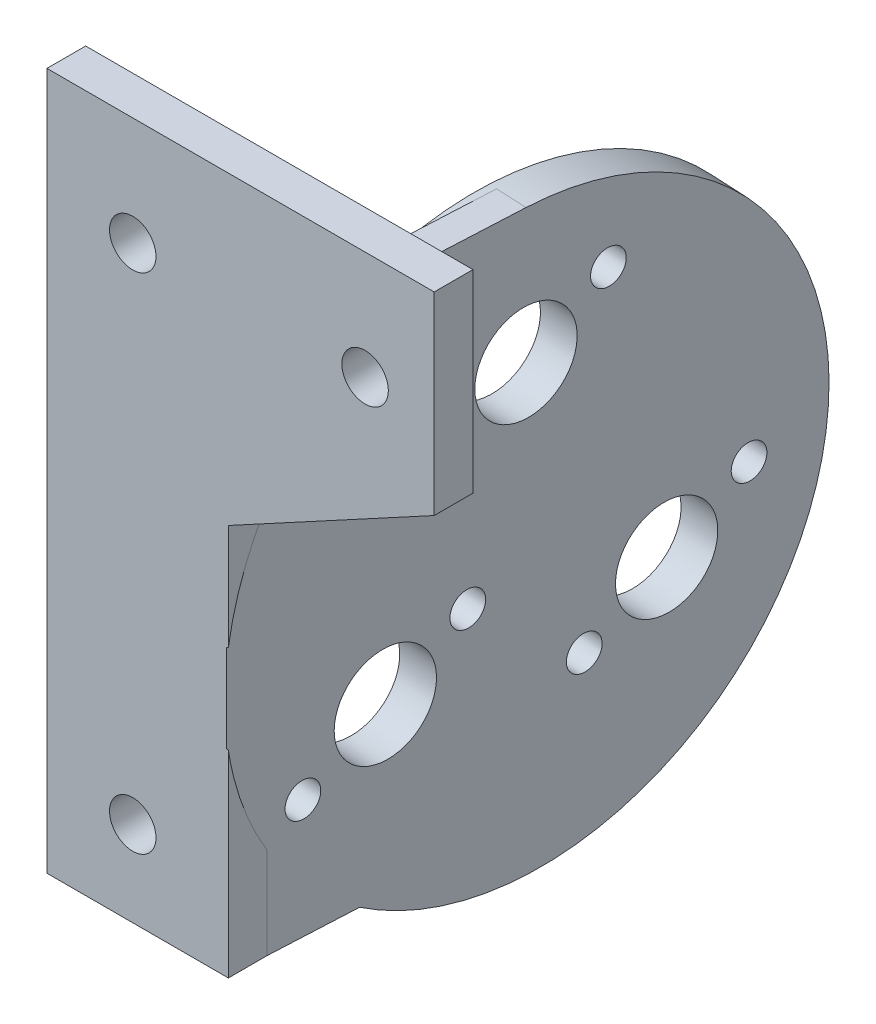
ISO-10303-21;
HEADER;
FILE_DESCRIPTION(('STEP AP214'),'2;1');
FILE_NAME('part.step','',(''),(''),'','','');
FILE_SCHEMA(('AUTOMOTIVE_DESIGN { 1 0 10303 214 1 1 1 1 }'));
ENDSEC;
DATA;
#1=APPLICATION_CONTEXT('core data for automotive mechanical design processes');
#2=APPLICATION_PROTOCOL_DEFINITION('international standard','automotive_design',2000,#1);
#3=PRODUCT_CONTEXT('',#1,'mechanical');
#4=PRODUCT('Part','Part','',(#3));
#5=PRODUCT_RELATED_PRODUCT_CATEGORY('part','',(#4));
#6=PRODUCT_DEFINITION_FORMATION('','',#4);
#7=PRODUCT_DEFINITION_CONTEXT('part definition',#1,'design');
#8=PRODUCT_DEFINITION('design','',#6,#7);
#9=PRODUCT_DEFINITION_SHAPE('','',#8);
#10=(LENGTH_UNIT() NAMED_UNIT(*) SI_UNIT(.MILLI.,.METRE.));
#11=(NAMED_UNIT(*) PLANE_ANGLE_UNIT() SI_UNIT($,.RADIAN.));
#12=(NAMED_UNIT(*) SI_UNIT($,.STERADIAN.) SOLID_ANGLE_UNIT());
#13=UNCERTAINTY_MEASURE_WITH_UNIT(LENGTH_MEASURE(1.E-05),#10,'distance_accuracy_value','');
#14=(GEOMETRIC_REPRESENTATION_CONTEXT(3) GLOBAL_UNCERTAINTY_ASSIGNED_CONTEXT((#13)) GLOBAL_UNIT_ASSIGNED_CONTEXT((#10,
#11,#12)) REPRESENTATION_CONTEXT('',''));
#15=CARTESIAN_POINT('',(0.,0.,0.));
#16=DIRECTION('',(0.,0.,1.));
#17=DIRECTION('',(1.,0.,0.));
#18=AXIS2_PLACEMENT_3D('',#15,#16,#17);
#19=CARTESIAN_POINT('',(0.,0.,39.3656227937916));
#20=DIRECTION('',(0.,0.,1.));
#21=DIRECTION('',(1.,0.,0.));
#22=AXIS2_PLACEMENT_3D('',#19,#20,#21);
#23=PLANE('',#22);
#24=CARTESIAN_POINT('',(241.789665534921,-11.7364504773365,39.3656227937916));
#25=DIRECTION('',(0.,0.,1.));
#26=DIRECTION('',(1.,0.,0.));
#27=AXIS2_PLACEMENT_3D('',#24,#25,#26);
#28=CIRCLE('',#27,1.90499999999999);
#29=CARTESIAN_POINT('',(243.694665534921,-11.7364504773365,39.3656227937916));
#30=VERTEX_POINT('',#29);
#31=EDGE_CURVE('E637',#30,#30,#28,.T.);
#32=ORIENTED_EDGE('',*,*,#31,.T.);
#33=EDGE_LOOP('',(#32));
#34=FACE_BOUND('',#33,.T.);
#35=CARTESIAN_POINT('',(241.789665534921,29.5385495226635,39.3656227937916));
#36=DIRECTION('',(0.,0.,1.));
#37=DIRECTION('',(1.,0.,0.));
#38=AXIS2_PLACEMENT_3D('',#35,#36,#37);
#39=CIRCLE('',#38,1.90499999999999);
#40=CARTESIAN_POINT('',(243.694665534921,29.5385495226635,39.3656227937916));
#41=VERTEX_POINT('',#40);
#42=EDGE_CURVE('E641',#41,#41,#39,.T.);
#43=ORIENTED_EDGE('',*,*,#42,.T.);
#44=EDGE_LOOP('',(#43));
#45=FACE_BOUND('',#44,.T.);
#46=CARTESIAN_POINT('',(260.839665534921,29.5385495226635,39.3656227937916));
#47=DIRECTION('',(0.,0.,1.));
#48=DIRECTION('',(1.,0.,0.));
#49=AXIS2_PLACEMENT_3D('',#46,#47,#48);
#50=CIRCLE('',#49,1.90499999999999);
#51=CARTESIAN_POINT('',(262.744665534921,29.5385495226635,39.3656227937916));
#52=VERTEX_POINT('',#51);
#53=EDGE_CURVE('E346',#52,#52,#50,.T.);
#54=ORIENTED_EDGE('',*,*,#53,.T.);
#55=EDGE_LOOP('',(#54));
#56=FACE_BOUND('',#55,.T.);
#57=DIRECTION('',(0.,1.,0.));
#58=VECTOR('',#57,1.);
#59=CARTESIAN_POINT('',(247.086588779306,4.48040659166999E-13,39.3656227937916));
#60=LINE('',#59,#58);
#61=CARTESIAN_POINT('',(247.086588779306,-18.7214504773365,39.3656227937916));
#62=VERTEX_POINT('',#61);
#63=CARTESIAN_POINT('',(247.086588779306,-11.0177145985927,39.3656227937916));
#64=VERTEX_POINT('',#63);
#65=EDGE_CURVE('E308',#62,#64,#60,.T.);
#66=ORIENTED_EDGE('',*,*,#65,.F.);
#67=DIRECTION('',(-1.,0.,0.));
#68=VECTOR('',#67,1.);
#69=CARTESIAN_POINT('',(266.505940447926,-18.7214504773365,39.3656227937916));
#70=LINE('',#69,#68);
#71=CARTESIAN_POINT('',(234.755940447926,-18.7214504773365,39.3656227937916));
#72=VERTEX_POINT('',#71);
#73=EDGE_CURVE('E200',#62,#72,#70,.T.);
#74=ORIENTED_EDGE('',*,*,#73,.T.);
#75=DIRECTION('',(0.,1.,0.));
#76=VECTOR('',#75,1.);
#77=CARTESIAN_POINT('',(234.755940447926,-18.7214504773365,39.3656227937916));
#78=LINE('',#77,#76);
#79=CARTESIAN_POINT('',(234.755940447926,38.4285495226636,39.3656227937916));
#80=VERTEX_POINT('',#79);
#81=EDGE_CURVE('E203',#72,#80,#78,.T.);
#82=ORIENTED_EDGE('',*,*,#81,.T.);
#83=DIRECTION('',(1.,0.,0.));
#84=VECTOR('',#83,1.);
#85=CARTESIAN_POINT('',(266.505940447926,38.4285495226636,39.3656227937916));
#86=LINE('',#85,#84);
#87=CARTESIAN_POINT('',(266.505940447926,38.4285495226636,39.3656227937916));
#88=VERTEX_POINT('',#87);
#89=EDGE_CURVE('E205',#80,#88,#86,.T.);
#90=ORIENTED_EDGE('',*,*,#89,.T.);
#91=DIRECTION('',(0.,-1.,0.));
#92=VECTOR('',#91,1.);
#93=CARTESIAN_POINT('',(266.505940447926,-18.7214504773365,39.3656227937916));
#94=LINE('',#93,#92);
#95=CARTESIAN_POINT('',(266.505940447926,22.5535495226636,39.3656227937916));
#96=VERTEX_POINT('',#95);
#97=EDGE_CURVE('E197',#88,#96,#94,.T.);
#98=ORIENTED_EDGE('',*,*,#97,.T.);
#99=DIRECTION('',(0.879222113749646,0.476412084957554,0.));
#100=VECTOR('',#99,1.);
#101=CARTESIAN_POINT('',(249.629734325934,13.4090700799627,39.3656227937916));
#102=LINE('',#101,#100);
#103=CARTESIAN_POINT('',(249.629734325934,13.4090700799628,39.3656227937916));
#104=VERTEX_POINT('',#103);
#105=EDGE_CURVE('E166',#104,#96,#102,.T.);
#106=ORIENTED_EDGE('',*,*,#105,.F.);
#107=DIRECTION('',(0.,1.,0.));
#108=VECTOR('',#107,1.);
#109=CARTESIAN_POINT('',(249.629734325934,4.52652130039207E-13,39.3656227937916));
#110=LINE('',#109,#108);
#111=CARTESIAN_POINT('',(249.629734325934,24.7887495226636,39.3656227937916));
#112=VERTEX_POINT('',#111);
#113=EDGE_CURVE('E294',#104,#112,#110,.T.);
#114=ORIENTED_EDGE('',*,*,#113,.T.);
#115=DIRECTION('',(-1.,0.,0.));
#116=VECTOR('',#115,1.);
#117=CARTESIAN_POINT('',(0.,24.7887495226633,39.3656227937916));
#118=LINE('',#117,#116);
#119=CARTESIAN_POINT('',(247.086588779306,24.7887495226636,39.3656227937917));
#120=VERTEX_POINT('',#119);
#121=EDGE_CURVE('E55',#112,#120,#118,.T.);
#122=ORIENTED_EDGE('',*,*,#121,.T.);
#123=DIRECTION('',(0.,1.,0.));
#124=VECTOR('',#123,1.);
#125=CARTESIAN_POINT('',(247.086588779306,4.48040659166999E-13,39.3656227937916));
#126=LINE('',#125,#124);
#127=CARTESIAN_POINT('',(247.086588779306,13.1988136439199,39.3656227937916));
#128=VERTEX_POINT('',#127);
#129=EDGE_CURVE('E13',#128,#120,#126,.T.);
#130=ORIENTED_EDGE('',*,*,#129,.F.);
#131=CARTESIAN_POINT('',(656.798051554358,1.09054952266401,39.3656227937916));
#132=DIRECTION('',(0.,0.,1.));
#133=DIRECTION('',(1.,0.,0.));
#134=AXIS2_PLACEMENT_3D('',#131,#132,#133);
#135=ELLIPSE('',#134,476.619975598426,23.6982);
#136=CARTESIAN_POINT('',(246.450802392648,13.1454693154364,39.3656227937917));
#137=VERTEX_POINT('',#136);
#138=EDGE_CURVE('E225',#128,#137,#135,.T.);
#139=ORIENTED_EDGE('',*,*,#138,.T.);
#140=DIRECTION('',(0.,1.,0.));
#141=VECTOR('',#140,1.);
#142=CARTESIAN_POINT('',(246.450802392648,3.31426619224149E-13,39.3656227937916));
#143=LINE('',#142,#141);
#144=CARTESIAN_POINT('',(246.450802392648,-10.9643702701092,39.3656227937917));
#145=VERTEX_POINT('',#144);
#146=EDGE_CURVE('E226',#145,#137,#143,.T.);
#147=ORIENTED_EDGE('',*,*,#146,.F.);
#148=EDGE_CURVE('E223',#145,#64,#135,.T.);
#149=ORIENTED_EDGE('',*,*,#148,.T.);
#150=EDGE_LOOP('',(#66,#74,#82,#90,#98,#106,#114,#122,#130,#139,#147,#149));
#151=FACE_BOUND('',#150,.T.);
#152=ADVANCED_FACE('F47',(#34,#45,#56,#151),#23,.F.);
#153=CARTESIAN_POINT('',(250.967487849639,3.36513521201975E-13,12.4939016548298));
#154=DIRECTION('',(-0.998763127563595,0.,-0.0497213738686581));
#155=DIRECTION('',(-0.0497213738686581,0.,0.998763127563595));
#156=AXIS2_PLACEMENT_3D('',#153,#154,#155);
#157=PLANE('',#156);
#158=CARTESIAN_POINT('',(250.315881025027,10.0694495226636,25.5828575595881));
#159=DIRECTION('',(-0.998763127563595,0.,-0.0497213738686581));
#160=DIRECTION('',(-0.0497213738686581,0.,0.998763127563595));
#161=AXIS2_PLACEMENT_3D('',#158,#159,#160);
#162=CIRCLE('',#161,1.397);
#163=CARTESIAN_POINT('',(250.246420265733,10.0694495226636,26.9781296487944));
#164=VERTEX_POINT('',#163);
#165=EDGE_CURVE('E234',#164,#164,#162,.F.);
#166=ORIENTED_EDGE('',*,*,#165,.F.);
#167=EDGE_LOOP('',(#166));
#168=FACE_BOUND('',#167,.T.);
#169=CARTESIAN_POINT('',(250.956802885382,17.5116495226636,12.7085326573293));
#170=DIRECTION('',(-0.998763127563595,0.,-0.0497213738686581));
#171=DIRECTION('',(-0.0497213738686581,0.,0.998763127563595));
#172=AXIS2_PLACEMENT_3D('',#169,#170,#171);
#173=CIRCLE('',#172,1.397);
#174=CARTESIAN_POINT('',(250.887342126087,17.5116495226636,14.1038047465357));
#175=VERTEX_POINT('',#174);
#176=EDGE_CURVE('E283',#175,#175,#173,.F.);
#177=ORIENTED_EDGE('',*,*,#176,.F.);
#178=EDGE_LOOP('',(#177));
#179=FACE_BOUND('',#178,.T.);
#180=CARTESIAN_POINT('',(250.636341955205,13.7905495226636,19.1456951084587));
#181=DIRECTION('',(-0.998763127563595,0.,-0.0497213738686581));
#182=DIRECTION('',(-0.0497213738686581,0.,0.998763127563595));
#183=AXIS2_PLACEMENT_3D('',#180,#181,#182);
#184=CIRCLE('',#183,4.0005);
#185=CARTESIAN_POINT('',(250.437431599043,13.7905495226636,23.1412470002768));
#186=VERTEX_POINT('',#185);
#187=EDGE_CURVE('E280',#186,#186,#184,.T.);
#188=ORIENTED_EDGE('',*,*,#187,.T.);
#189=EDGE_LOOP('',(#188));
#190=FACE_BOUND('',#189,.T.);
#191=CARTESIAN_POINT('',(249.769019369434,-8.9805504773364,36.5677764181706));
#192=DIRECTION('',(-0.998763127563595,0.,-0.0497213738686581));
#193=DIRECTION('',(-0.0497213738686581,0.,0.998763127563595));
#194=AXIS2_PLACEMENT_3D('',#191,#192,#193);
#195=CIRCLE('',#194,1.397);
#196=CARTESIAN_POINT('',(249.69955861014,-8.9805504773364,37.963048507377));
#197=VERTEX_POINT('',#196);
#198=EDGE_CURVE('E277',#197,#197,#195,.T.);
#199=ORIENTED_EDGE('',*,*,#198,.T.);
#200=EDGE_LOOP('',(#199));
#201=FACE_BOUND('',#200,.T.);
#202=CARTESIAN_POINT('',(250.409941229789,-1.53835047733641,23.6934515159119));
#203=DIRECTION('',(-0.998763127563595,0.,-0.0497213738686581));
#204=DIRECTION('',(-0.0497213738686581,0.,0.998763127563595));
#205=AXIS2_PLACEMENT_3D('',#202,#203,#204);
#206=CIRCLE('',#205,1.397);
#207=CARTESIAN_POINT('',(250.340480470495,-1.53835047733641,25.0887236051182));
#208=VERTEX_POINT('',#207);
#209=EDGE_CURVE('E274',#208,#208,#206,.T.);
#210=ORIENTED_EDGE('',*,*,#209,.T.);
#211=EDGE_LOOP('',(#210));
#212=FACE_BOUND('',#211,.T.);
#213=CARTESIAN_POINT('',(250.86274268062,-8.98055047733636,14.5979387010055));
#214=DIRECTION('',(-0.998763127563595,0.,-0.0497213738686581));
#215=DIRECTION('',(-0.0497213738686581,0.,0.998763127563595));
#216=AXIS2_PLACEMENT_3D('',#213,#214,#215);
#217=CIRCLE('',#216,1.397);
#218=CARTESIAN_POINT('',(250.793281921325,-8.98055047733636,15.9932107902119));
#219=VERTEX_POINT('',#218);
#220=EDGE_CURVE('E271',#219,#219,#217,.T.);
#221=ORIENTED_EDGE('',*,*,#220,.T.);
#222=EDGE_LOOP('',(#221));
#223=FACE_BOUND('',#222,.T.);
#224=CARTESIAN_POINT('',(251.503664540975,-1.53835047733636,1.72361379874677));
#225=DIRECTION('',(-0.998763127563595,0.,-0.0497213738686581));
#226=DIRECTION('',(-0.0497213738686581,0.,0.998763127563595));
#227=AXIS2_PLACEMENT_3D('',#224,#225,#226);
#228=CIRCLE('',#227,1.397);
#229=CARTESIAN_POINT('',(251.43420378168,-1.53835047733636,3.11888588795311));
#230=VERTEX_POINT('',#229);
#231=EDGE_CURVE('E268',#230,#230,#228,.T.);
#232=ORIENTED_EDGE('',*,*,#231,.T.);
#233=EDGE_LOOP('',(#232));
#234=FACE_BOUND('',#233,.T.);
#235=CARTESIAN_POINT('',(251.183203610797,-5.25945047733636,8.16077624987614));
#236=DIRECTION('',(-0.998763127563595,0.,-0.0497213738686581));
#237=DIRECTION('',(-0.0497213738686581,0.,0.998763127563595));
#238=AXIS2_PLACEMENT_3D('',#235,#236,#237);
#239=CIRCLE('',#238,4.0005);
#240=CARTESIAN_POINT('',(250.984293254636,-5.25945047733636,12.1563281416943));
#241=VERTEX_POINT('',#240);
#242=EDGE_CURVE('E265',#241,#241,#239,.T.);
#243=ORIENTED_EDGE('',*,*,#242,.T.);
#244=EDGE_LOOP('',(#243));
#245=FACE_BOUND('',#244,.T.);
#246=CARTESIAN_POINT('',(250.089480299612,-5.2594504773364,30.1306139670413));
#247=DIRECTION('',(-0.998763127563595,0.,-0.0497213738686581));
#248=DIRECTION('',(-0.0497213738686581,0.,0.998763127563595));
#249=AXIS2_PLACEMENT_3D('',#246,#247,#248);
#250=CIRCLE('',#249,4.0005);
#251=CARTESIAN_POINT('',(249.89056994345,-5.2594504773364,34.1261658588594));
#252=VERTEX_POINT('',#251);
#253=EDGE_CURVE('E262',#252,#252,#250,.T.);
#254=ORIENTED_EDGE('',*,*,#253,.T.);
#255=EDGE_LOOP('',(#254));
#256=FACE_BOUND('',#255,.T.);
#257=DIRECTION('',(0.,1.,0.));
#258=VECTOR('',#257,1.);
#259=CARTESIAN_POINT('',(249.471673462776,3.3450783604052E-13,42.5406227937916));
#260=LINE('',#259,#258);
#261=CARTESIAN_POINT('',(249.471673462776,-2.50466801467512,42.5406227937916));
#262=VERTEX_POINT('',#261);
#263=CARTESIAN_POINT('',(249.471673462776,4.68576706000229,42.5406227937916));
#264=VERTEX_POINT('',#263);
#265=EDGE_CURVE('E153',#262,#264,#260,.T.);
#266=ORIENTED_EDGE('',*,*,#265,.F.);
#267=CARTESIAN_POINT('',(250.636341955205,1.09054952266359,19.1456951084587));
#268=DIRECTION('',(0.998763127563595,0.,0.0497213738686581));
#269=DIRECTION('',(0.0497213738686581,0.,-0.998763127563595));
#270=AXIS2_PLACEMENT_3D('',#267,#268,#269);
#271=CIRCLE('',#270,23.6982);
#272=CARTESIAN_POINT('',(249.629734325934,-11.2279710346293,39.3656227937955));
#273=VERTEX_POINT('',#272);
#274=EDGE_CURVE('E146',#262,#273,#271,.T.);
#275=ORIENTED_EDGE('',*,*,#274,.T.);
#276=DIRECTION('',(0.,1.,0.));
#277=VECTOR('',#276,1.);
#278=CARTESIAN_POINT('',(249.629734325934,-18.7214504773365,39.3656227937916));
#279=LINE('',#278,#277);
#280=CARTESIAN_POINT('',(249.629734325934,-18.7214504773365,39.3656227937916));
#281=VERTEX_POINT('',#280);
#282=EDGE_CURVE('E150',#281,#273,#279,.T.);
#283=ORIENTED_EDGE('',*,*,#282,.F.);
#284=DIRECTION('',(0.0497213738686586,0.,-0.998763127563595));
#285=VECTOR('',#284,1.);
#286=CARTESIAN_POINT('',(250.967487849639,-18.7214504773364,12.4939016548299));
#287=LINE('',#286,#285);
#288=CARTESIAN_POINT('',(249.989793268648,-18.7214504773365,32.1330471879209));
#289=VERTEX_POINT('',#288);
#290=EDGE_CURVE('E343',#281,#289,#287,.T.);
#291=ORIENTED_EDGE('',*,*,#290,.T.);
#292=CARTESIAN_POINT('',(250.636341955205,1.09054952266359,19.1456951084587));
#293=DIRECTION('',(-0.998763127563595,0.,-0.0497213738686581));
#294=DIRECTION('',(-0.0497213738686581,0.,0.998763127563595));
#295=AXIS2_PLACEMENT_3D('',#292,#293,#294);
#296=CIRCLE('',#295,23.6982);
#297=CARTESIAN_POINT('',(250.636341955205,24.7887495226636,19.1456951084587));
#298=VERTEX_POINT('',#297);
#299=EDGE_CURVE('E229',#298,#289,#296,.T.);
#300=ORIENTED_EDGE('',*,*,#299,.F.);
#301=DIRECTION('',(-0.0497213738686586,0.,0.998763127563595));
#302=VECTOR('',#301,1.);
#303=CARTESIAN_POINT('',(250.967487849639,24.7887495226636,12.4939016548299));
#304=LINE('',#303,#302);
#305=EDGE_CURVE('E298',#298,#112,#304,.T.);
#306=ORIENTED_EDGE('',*,*,#305,.T.);
#307=ORIENTED_EDGE('',*,*,#113,.F.);
#308=EDGE_CURVE('E157',#104,#264,#271,.T.);
#309=ORIENTED_EDGE('',*,*,#308,.T.);
#310=EDGE_LOOP('',(#266,#275,#283,#291,#300,#306,#307,#309));
#311=FACE_BOUND('',#310,.T.);
#312=ADVANCED_FACE('F148',(#168,#179,#190,#201,#212,#223,#234,#245,#256,#311),#157,.F.);
#313=CARTESIAN_POINT('',(0.,0.,42.5406227937916));
#314=DIRECTION('',(0.,0.,1.));
#315=DIRECTION('',(1.,0.,0.));
#316=AXIS2_PLACEMENT_3D('',#313,#314,#315);
#317=PLANE('',#316);
#318=CARTESIAN_POINT('',(241.789665534921,-11.7364504773365,42.5406227937916));
#319=DIRECTION('',(0.,0.,1.));
#320=DIRECTION('',(1.,0.,0.));
#321=AXIS2_PLACEMENT_3D('',#318,#319,#320);
#322=CIRCLE('',#321,1.90499999999999);
#323=CARTESIAN_POINT('',(243.694665534921,-11.7364504773365,42.5406227937916));
#324=VERTEX_POINT('',#323);
#325=EDGE_CURVE('E635',#324,#324,#322,.T.);
#326=ORIENTED_EDGE('',*,*,#325,.F.);
#327=EDGE_LOOP('',(#326));
#328=FACE_BOUND('',#327,.T.);
#329=CARTESIAN_POINT('',(241.789665534921,29.5385495226635,42.5406227937916));
#330=DIRECTION('',(0.,0.,1.));
#331=DIRECTION('',(1.,0.,0.));
#332=AXIS2_PLACEMENT_3D('',#329,#330,#331);
#333=CIRCLE('',#332,1.90499999999999);
#334=CARTESIAN_POINT('',(243.694665534921,29.5385495226635,42.5406227937916));
#335=VERTEX_POINT('',#334);
#336=EDGE_CURVE('E638',#335,#335,#333,.T.);
#337=ORIENTED_EDGE('',*,*,#336,.F.);
#338=EDGE_LOOP('',(#337));
#339=FACE_BOUND('',#338,.T.);
#340=CARTESIAN_POINT('',(260.839665534921,29.5385495226635,42.5406227937916));
#341=DIRECTION('',(0.,0.,1.));
#342=DIRECTION('',(1.,0.,0.));
#343=AXIS2_PLACEMENT_3D('',#340,#341,#342);
#344=CIRCLE('',#343,1.90499999999999);
#345=CARTESIAN_POINT('',(262.744665534921,29.5385495226635,42.5406227937916));
#346=VERTEX_POINT('',#345);
#347=EDGE_CURVE('E350',#346,#346,#344,.T.);
#348=ORIENTED_EDGE('',*,*,#347,.F.);
#349=EDGE_LOOP('',(#348));
#350=FACE_BOUND('',#349,.T.);
#351=DIRECTION('',(0.,1.,0.));
#352=VECTOR('',#351,1.);
#353=CARTESIAN_POINT('',(249.629734325934,-18.7214504773365,42.5406227937916));
#354=LINE('',#353,#352);
#355=CARTESIAN_POINT('',(249.629734325934,4.73660278492772,42.5406227937916));
#356=VERTEX_POINT('',#355);
#357=CARTESIAN_POINT('',(249.629734325934,13.4090700799627,42.5406227937916));
#358=VERTEX_POINT('',#357);
#359=EDGE_CURVE('E185',#356,#358,#354,.T.);
#360=ORIENTED_EDGE('',*,*,#359,.T.);
#361=DIRECTION('',(0.879222113749646,0.476412084957554,0.));
#362=VECTOR('',#361,1.);
#363=CARTESIAN_POINT('',(249.629734325934,13.4090700799627,42.5406227937916));
#364=LINE('',#363,#362);
#365=CARTESIAN_POINT('',(266.505940447926,22.5535495226636,42.5406227937916));
#366=VERTEX_POINT('',#365);
#367=EDGE_CURVE('E184',#358,#366,#364,.T.);
#368=ORIENTED_EDGE('',*,*,#367,.T.);
#369=DIRECTION('',(0.,-1.,0.));
#370=VECTOR('',#369,1.);
#371=CARTESIAN_POINT('',(266.505940447926,-18.7214504773365,42.5406227937916));
#372=LINE('',#371,#370);
#373=CARTESIAN_POINT('',(266.505940447926,38.4285495226636,42.5406227937916));
#374=VERTEX_POINT('',#373);
#375=EDGE_CURVE('E191',#374,#366,#372,.T.);
#376=ORIENTED_EDGE('',*,*,#375,.F.);
#377=DIRECTION('',(1.,0.,0.));
#378=VECTOR('',#377,1.);
#379=CARTESIAN_POINT('',(266.505940447926,38.4285495226636,42.5406227937916));
#380=LINE('',#379,#378);
#381=CARTESIAN_POINT('',(234.755940447926,38.4285495226636,42.5406227937916));
#382=VERTEX_POINT('',#381);
#383=EDGE_CURVE('E201',#382,#374,#380,.T.);
#384=ORIENTED_EDGE('',*,*,#383,.F.);
#385=DIRECTION('',(0.,1.,0.));
#386=VECTOR('',#385,1.);
#387=CARTESIAN_POINT('',(234.755940447926,-18.7214504773365,42.5406227937916));
#388=LINE('',#387,#386);
#389=CARTESIAN_POINT('',(234.755940447926,-18.7214504773365,42.5406227937916));
#390=VERTEX_POINT('',#389);
#391=EDGE_CURVE('E212',#390,#382,#388,.T.);
#392=ORIENTED_EDGE('',*,*,#391,.F.);
#393=DIRECTION('',(-1.,0.,0.));
#394=VECTOR('',#393,1.);
#395=CARTESIAN_POINT('',(266.505940447926,-18.7214504773365,42.5406227937916));
#396=LINE('',#395,#394);
#397=CARTESIAN_POINT('',(249.629734325934,-18.7214504773365,42.5406227937916));
#398=VERTEX_POINT('',#397);
#399=EDGE_CURVE('E210',#398,#390,#396,.T.);
#400=ORIENTED_EDGE('',*,*,#399,.F.);
#401=CARTESIAN_POINT('',(249.629734325934,-2.55550373960054,42.5406227937916));
#402=VERTEX_POINT('',#401);
#403=EDGE_CURVE('E182',#398,#402,#354,.T.);
#404=ORIENTED_EDGE('',*,*,#403,.T.);
#405=CARTESIAN_POINT('',(720.574908130988,1.09054952266422,42.5406227937916));
#406=DIRECTION('',(0.,0.,1.));
#407=DIRECTION('',(-1.,0.,0.));
#408=AXIS2_PLACEMENT_3D('',#405,#406,#407);
#409=ELLIPSE('',#408,476.619975598425,23.6982);
#410=EDGE_CURVE('E170',#402,#262,#409,.F.);
#411=ORIENTED_EDGE('',*,*,#410,.T.);
#412=ORIENTED_EDGE('',*,*,#265,.T.);
#413=EDGE_CURVE('E167',#264,#356,#409,.F.);
#414=ORIENTED_EDGE('',*,*,#413,.T.);
#415=EDGE_LOOP('',(#360,#368,#376,#384,#392,#400,#404,#411,#412,#414));
#416=FACE_BOUND('',#415,.T.);
#417=ADVANCED_FACE('F315',(#328,#339,#350,#416),#317,.T.);
#418=CARTESIAN_POINT('',(249.629734325934,-18.7214504773365,42.5406227937916));
#419=DIRECTION('',(-1.,0.,0.));
#420=DIRECTION('',(0.,-1.,0.));
#421=AXIS2_PLACEMENT_3D('',#418,#419,#420);
#422=PLANE('',#421);
#423=CARTESIAN_POINT('',(249.629734325934,1.09054952266359,19.0955832121614));
#424=DIRECTION('',(-1.,0.,0.));
#425=DIRECTION('',(0.,0.,-1.));
#426=AXIS2_PLACEMENT_3D('',#423,#424,#425);
#427=ELLIPSE('',#426,23.7275479500429,23.6982);
#428=EDGE_CURVE('E172',#104,#356,#427,.F.);
#429=ORIENTED_EDGE('',*,*,#428,.F.);
#430=DIRECTION('',(0.,0.,-1.));
#431=VECTOR('',#430,1.);
#432=CARTESIAN_POINT('',(249.629734325934,13.4090700799627,42.5406227937916));
#433=LINE('',#432,#431);
#434=EDGE_CURVE('E187',#358,#104,#433,.T.);
#435=ORIENTED_EDGE('',*,*,#434,.F.);
#436=ORIENTED_EDGE('',*,*,#359,.F.);
#437=EDGE_LOOP('',(#429,#435,#436));
#438=FACE_BOUND('',#437,.T.);
#439=ADVANCED_FACE('F319',(#438),#422,.F.);
#440=EDGE_CURVE('E162',#402,#273,#427,.F.);
#441=ORIENTED_EDGE('',*,*,#440,.F.);
#442=ORIENTED_EDGE('',*,*,#403,.F.);
#443=DIRECTION('',(0.,0.,-1.));
#444=VECTOR('',#443,1.);
#445=CARTESIAN_POINT('',(249.629734325934,-18.7214504773365,42.5406227937916));
#446=LINE('',#445,#444);
#447=EDGE_CURVE('E165',#398,#281,#446,.T.);
#448=ORIENTED_EDGE('',*,*,#447,.T.);
#449=ORIENTED_EDGE('',*,*,#282,.T.);
#450=EDGE_LOOP('',(#441,#442,#448,#449));
#451=FACE_BOUND('',#450,.T.);
#452=ADVANCED_FACE('F161',(#451),#422,.F.);
#453=CARTESIAN_POINT('',(247.46526902519,1.09054952266359,18.9878297464257));
#454=DIRECTION('',(0.998763127563595,0.,0.0497213738686581));
#455=DIRECTION('',(0.0497213738686581,0.,-0.998763127563595));
#456=AXIS2_PLACEMENT_3D('',#453,#454,#455);
#457=CYLINDRICAL_SURFACE('',#456,23.6982);
#458=ORIENTED_EDGE('',*,*,#299,.T.);
#459=DIRECTION('',(0.998763127563595,0.,0.0497213738686581));
#460=VECTOR('',#459,1.);
#461=CARTESIAN_POINT('',(247.452934924637,-18.7214504773365,32.0067548982945));
#462=LINE('',#461,#460);
#463=CARTESIAN_POINT('',(247.452934924637,-18.7214504773365,32.0067548982945));
#464=VERTEX_POINT('',#463);
#465=EDGE_CURVE('E62',#464,#289,#462,.T.);
#466=ORIENTED_EDGE('',*,*,#465,.F.);
#467=CARTESIAN_POINT('',(248.099483611193,1.09054952266359,19.0194028188323));
#468=DIRECTION('',(0.998763127563595,0.,0.0497213738686586));
#469=DIRECTION('',(0.0497213738686586,0.,-0.998763127563595));
#470=AXIS2_PLACEMENT_3D('',#467,#468,#469);
#471=CIRCLE('',#470,23.6982);
#472=EDGE_CURVE('E67',#64,#464,#471,.T.);
#473=ORIENTED_EDGE('',*,*,#472,.F.);
#474=ORIENTED_EDGE('',*,*,#148,.F.);
#475=CARTESIAN_POINT('',(247.46526902519,1.09054952266359,18.9878297464257));
#476=DIRECTION('',(-0.998763127563595,0.,-0.0497213738686581));
#477=DIRECTION('',(-0.0497213738686581,0.,0.998763127563595));
#478=AXIS2_PLACEMENT_3D('',#475,#476,#477);
#479=CIRCLE('',#478,23.6982);
#480=EDGE_CURVE('E230',#137,#145,#479,.T.);
#481=ORIENTED_EDGE('',*,*,#480,.F.);
#482=ORIENTED_EDGE('',*,*,#138,.F.);
#483=CARTESIAN_POINT('',(248.099483611193,1.09054952266359,19.0194028188323));
#484=DIRECTION('',(0.998763127563595,0.,0.0497213738686586));
#485=DIRECTION('',(0.0497213738686586,0.,-0.998763127563595));
#486=AXIS2_PLACEMENT_3D('',#483,#484,#485);
#487=CIRCLE('',#486,23.6982);
#488=CARTESIAN_POINT('',(248.099483611193,24.7887495226636,19.0194028188323));
#489=VERTEX_POINT('',#488);
#490=EDGE_CURVE('E305',#489,#128,#487,.T.);
#491=ORIENTED_EDGE('',*,*,#490,.F.);
#492=DIRECTION('',(0.998763127563595,0.,0.0497213738686581));
#493=VECTOR('',#492,1.);
#494=CARTESIAN_POINT('',(248.099483611193,24.7887495226636,19.0194028188323));
#495=LINE('',#494,#493);
#496=EDGE_CURVE('E302',#489,#298,#495,.T.);
#497=ORIENTED_EDGE('',*,*,#496,.T.);
#498=EDGE_LOOP('',(#458,#466,#473,#474,#481,#482,#491,#497));
#499=FACE_BOUND('',#498,.T.);
#500=ADVANCED_FACE('F49',(#499),#457,.T.);
#501=CARTESIAN_POINT('',(247.796414919624,3.33230903968384E-13,12.3360362927968));
#502=DIRECTION('',(-0.998763127563595,0.,-0.0497213738686581));
#503=DIRECTION('',(-0.0497213738686581,0.,0.998763127563595));
#504=AXIS2_PLACEMENT_3D('',#501,#502,#503);
#505=PLANE('',#504);
#506=CARTESIAN_POINT('',(246.918407369597,-5.25945047733641,29.9727486050083));
#507=DIRECTION('',(-0.998763127563595,0.,-0.0497213738686581));
#508=DIRECTION('',(-0.0497213738686581,0.,0.998763127563595));
#509=AXIS2_PLACEMENT_3D('',#506,#507,#508);
#510=CIRCLE('',#509,4.0005);
#511=CARTESIAN_POINT('',(246.719497013436,-5.25945047733641,33.9683004968264));
#512=VERTEX_POINT('',#511);
#513=EDGE_CURVE('E233',#512,#512,#510,.T.);
#514=ORIENTED_EDGE('',*,*,#513,.F.);
#515=EDGE_LOOP('',(#514));
#516=FACE_BOUND('',#515,.T.);
#517=CARTESIAN_POINT('',(248.012130680783,-5.25945047733637,8.00291088784315));
#518=DIRECTION('',(-0.998763127563595,0.,-0.0497213738686581));
#519=DIRECTION('',(-0.0497213738686581,0.,0.998763127563595));
#520=AXIS2_PLACEMENT_3D('',#517,#518,#519);
#521=CIRCLE('',#520,4.0005);
#522=CARTESIAN_POINT('',(247.813220324621,-5.25945047733637,11.9984627796613));
#523=VERTEX_POINT('',#522);
#524=EDGE_CURVE('E237',#523,#523,#521,.T.);
#525=ORIENTED_EDGE('',*,*,#524,.F.);
#526=EDGE_LOOP('',(#525));
#527=FACE_BOUND('',#526,.T.);
#528=CARTESIAN_POINT('',(248.33259161096,-1.53835047733637,1.56574843671378));
#529=DIRECTION('',(-0.998763127563595,0.,-0.0497213738686581));
#530=DIRECTION('',(-0.0497213738686581,0.,0.998763127563595));
#531=AXIS2_PLACEMENT_3D('',#528,#529,#530);
#532=CIRCLE('',#531,1.397);
#533=CARTESIAN_POINT('',(248.263130851666,-1.53835047733637,2.96102052592012));
#534=VERTEX_POINT('',#533);
#535=EDGE_CURVE('E240',#534,#534,#532,.T.);
#536=ORIENTED_EDGE('',*,*,#535,.F.);
#537=EDGE_LOOP('',(#536));
#538=FACE_BOUND('',#537,.T.);
#539=CARTESIAN_POINT('',(247.691669750605,-8.98055047733636,14.4400733389725));
#540=DIRECTION('',(-0.998763127563595,0.,-0.0497213738686581));
#541=DIRECTION('',(-0.0497213738686581,0.,0.998763127563595));
#542=AXIS2_PLACEMENT_3D('',#539,#540,#541);
#543=CIRCLE('',#542,1.397);
#544=CARTESIAN_POINT('',(247.622208991311,-8.98055047733636,15.8353454281789));
#545=VERTEX_POINT('',#544);
#546=EDGE_CURVE('E243',#545,#545,#543,.T.);
#547=ORIENTED_EDGE('',*,*,#546,.F.);
#548=EDGE_LOOP('',(#547));
#549=FACE_BOUND('',#548,.T.);
#550=CARTESIAN_POINT('',(247.238868299775,-1.53835047733641,23.5355861538789));
#551=DIRECTION('',(-0.998763127563595,0.,-0.0497213738686581));
#552=DIRECTION('',(-0.0497213738686581,0.,0.998763127563595));
#553=AXIS2_PLACEMENT_3D('',#550,#551,#552);
#554=CIRCLE('',#553,1.397);
#555=CARTESIAN_POINT('',(247.16940754048,-1.53835047733641,24.9308582430853));
#556=VERTEX_POINT('',#555);
#557=EDGE_CURVE('E246',#556,#556,#554,.T.);
#558=ORIENTED_EDGE('',*,*,#557,.F.);
#559=EDGE_LOOP('',(#558));
#560=FACE_BOUND('',#559,.T.);
#561=CARTESIAN_POINT('',(246.59794643942,-8.9805504773364,36.4099110561376));
#562=DIRECTION('',(-0.998763127563595,0.,-0.0497213738686581));
#563=DIRECTION('',(-0.0497213738686581,0.,0.998763127563595));
#564=AXIS2_PLACEMENT_3D('',#561,#562,#563);
#565=CIRCLE('',#564,1.397);
#566=CARTESIAN_POINT('',(246.528485680125,-8.9805504773364,37.805183145344));
#567=VERTEX_POINT('',#566);
#568=EDGE_CURVE('E249',#567,#567,#565,.T.);
#569=ORIENTED_EDGE('',*,*,#568,.F.);
#570=EDGE_LOOP('',(#569));
#571=FACE_BOUND('',#570,.T.);
#572=CARTESIAN_POINT('',(247.46526902519,13.7905495226636,18.9878297464257));
#573=DIRECTION('',(-0.998763127563595,0.,-0.0497213738686581));
#574=DIRECTION('',(-0.0497213738686581,0.,0.998763127563595));
#575=AXIS2_PLACEMENT_3D('',#572,#573,#574);
#576=CIRCLE('',#575,4.0005);
#577=CARTESIAN_POINT('',(247.266358669029,13.7905495226636,22.9833816382439));
#578=VERTEX_POINT('',#577);
#579=EDGE_CURVE('E252',#578,#578,#576,.T.);
#580=ORIENTED_EDGE('',*,*,#579,.F.);
#581=EDGE_LOOP('',(#580));
#582=FACE_BOUND('',#581,.T.);
#583=CARTESIAN_POINT('',(247.785729955367,17.5116495226636,12.5506672952963));
#584=DIRECTION('',(-0.998763127563595,0.,-0.0497213738686581));
#585=DIRECTION('',(-0.0497213738686581,0.,0.998763127563595));
#586=AXIS2_PLACEMENT_3D('',#583,#584,#585);
#587=CIRCLE('',#586,1.397);
#588=CARTESIAN_POINT('',(247.716269196073,17.5116495226636,13.9459393845027));
#589=VERTEX_POINT('',#588);
#590=EDGE_CURVE('E255',#589,#589,#587,.F.);
#591=ORIENTED_EDGE('',*,*,#590,.T.);
#592=EDGE_LOOP('',(#591));
#593=FACE_BOUND('',#592,.T.);
#594=CARTESIAN_POINT('',(247.144808095013,10.0694495226636,25.4249921975551));
#595=DIRECTION('',(-0.998763127563595,0.,-0.0497213738686581));
#596=DIRECTION('',(-0.0497213738686581,0.,0.998763127563595));
#597=AXIS2_PLACEMENT_3D('',#594,#595,#596);
#598=CIRCLE('',#597,1.397);
#599=CARTESIAN_POINT('',(247.075347335718,10.0694495226636,26.8202642867614));
#600=VERTEX_POINT('',#599);
#601=EDGE_CURVE('E258',#600,#600,#598,.F.);
#602=ORIENTED_EDGE('',*,*,#601,.T.);
#603=EDGE_LOOP('',(#602));
#604=FACE_BOUND('',#603,.T.);
#605=ORIENTED_EDGE('',*,*,#480,.T.);
#606=ORIENTED_EDGE('',*,*,#146,.T.);
#607=EDGE_LOOP('',(#605,#606));
#608=FACE_BOUND('',#607,.T.);
#609=ADVANCED_FACE('F359',(#516,#527,#538,#549,#560,#571,#582,#593,#604,#608),#505,.T.);
#610=CARTESIAN_POINT('',(247.785729955367,17.5116495226636,12.5506672952963));
#611=DIRECTION('',(0.998763127563595,0.,0.0497213738686581));
#612=DIRECTION('',(0.0497213738686581,0.,-0.998763127563595));
#613=AXIS2_PLACEMENT_3D('',#610,#611,#612);
#614=CYLINDRICAL_SURFACE('',#613,1.397);
#615=ORIENTED_EDGE('',*,*,#590,.F.);
#616=EDGE_LOOP('',(#615));
#617=FACE_BOUND('',#616,.T.);
#618=ORIENTED_EDGE('',*,*,#176,.T.);
#619=EDGE_LOOP('',(#618));
#620=FACE_BOUND('',#619,.T.);
#621=ADVANCED_FACE('F361',(#617,#620),#614,.F.);
#622=CARTESIAN_POINT('',(247.46526902519,13.7905495226636,18.9878297464257));
#623=DIRECTION('',(0.998763127563595,0.,0.0497213738686581));
#624=DIRECTION('',(0.0497213738686581,0.,-0.998763127563595));
#625=AXIS2_PLACEMENT_3D('',#622,#623,#624);
#626=CYLINDRICAL_SURFACE('',#625,4.0005);
#627=ORIENTED_EDGE('',*,*,#579,.T.);
#628=EDGE_LOOP('',(#627));
#629=FACE_BOUND('',#628,.T.);
#630=ORIENTED_EDGE('',*,*,#187,.F.);
#631=EDGE_LOOP('',(#630));
#632=FACE_BOUND('',#631,.T.);
#633=ADVANCED_FACE('F368',(#629,#632),#626,.F.);
#634=CARTESIAN_POINT('',(246.59794643942,-8.9805504773364,36.4099110561376));
#635=DIRECTION('',(0.998763127563595,0.,0.0497213738686581));
#636=DIRECTION('',(0.0497213738686581,0.,-0.998763127563595));
#637=AXIS2_PLACEMENT_3D('',#634,#635,#636);
#638=CYLINDRICAL_SURFACE('',#637,1.397);
#639=ORIENTED_EDGE('',*,*,#568,.T.);
#640=EDGE_LOOP('',(#639));
#641=FACE_BOUND('',#640,.T.);
#642=ORIENTED_EDGE('',*,*,#198,.F.);
#643=EDGE_LOOP('',(#642));
#644=FACE_BOUND('',#643,.T.);
#645=ADVANCED_FACE('F413',(#641,#644),#638,.F.);
#646=CARTESIAN_POINT('',(247.238868299775,-1.53835047733641,23.5355861538789));
#647=DIRECTION('',(0.998763127563595,0.,0.0497213738686581));
#648=DIRECTION('',(0.0497213738686581,0.,-0.998763127563595));
#649=AXIS2_PLACEMENT_3D('',#646,#647,#648);
#650=CYLINDRICAL_SURFACE('',#649,1.397);
#651=ORIENTED_EDGE('',*,*,#557,.T.);
#652=EDGE_LOOP('',(#651));
#653=FACE_BOUND('',#652,.T.);
#654=ORIENTED_EDGE('',*,*,#209,.F.);
#655=EDGE_LOOP('',(#654));
#656=FACE_BOUND('',#655,.T.);
#657=ADVANCED_FACE('F417',(#653,#656),#650,.F.);
#658=CARTESIAN_POINT('',(247.691669750605,-8.98055047733636,14.4400733389725));
#659=DIRECTION('',(0.998763127563595,0.,0.0497213738686581));
#660=DIRECTION('',(0.0497213738686581,0.,-0.998763127563595));
#661=AXIS2_PLACEMENT_3D('',#658,#659,#660);
#662=CYLINDRICAL_SURFACE('',#661,1.397);
#663=ORIENTED_EDGE('',*,*,#546,.T.);
#664=EDGE_LOOP('',(#663));
#665=FACE_BOUND('',#664,.T.);
#666=ORIENTED_EDGE('',*,*,#220,.F.);
#667=EDGE_LOOP('',(#666));
#668=FACE_BOUND('',#667,.T.);
#669=ADVANCED_FACE('F421',(#665,#668),#662,.F.);
#670=CARTESIAN_POINT('',(248.33259161096,-1.53835047733637,1.56574843671378));
#671=DIRECTION('',(0.998763127563595,0.,0.0497213738686581));
#672=DIRECTION('',(0.0497213738686581,0.,-0.998763127563595));
#673=AXIS2_PLACEMENT_3D('',#670,#671,#672);
#674=CYLINDRICAL_SURFACE('',#673,1.397);
#675=ORIENTED_EDGE('',*,*,#535,.T.);
#676=EDGE_LOOP('',(#675));
#677=FACE_BOUND('',#676,.T.);
#678=ORIENTED_EDGE('',*,*,#231,.F.);
#679=EDGE_LOOP('',(#678));
#680=FACE_BOUND('',#679,.T.);
#681=ADVANCED_FACE('F425',(#677,#680),#674,.F.);
#682=CARTESIAN_POINT('',(248.012130680783,-5.25945047733637,8.00291088784315));
#683=DIRECTION('',(0.998763127563595,0.,0.0497213738686581));
#684=DIRECTION('',(0.0497213738686581,0.,-0.998763127563595));
#685=AXIS2_PLACEMENT_3D('',#682,#683,#684);
#686=CYLINDRICAL_SURFACE('',#685,4.0005);
#687=ORIENTED_EDGE('',*,*,#524,.T.);
#688=EDGE_LOOP('',(#687));
#689=FACE_BOUND('',#688,.T.);
#690=ORIENTED_EDGE('',*,*,#242,.F.);
#691=EDGE_LOOP('',(#690));
#692=FACE_BOUND('',#691,.T.);
#693=ADVANCED_FACE('F406',(#689,#692),#686,.F.);
#694=CARTESIAN_POINT('',(246.918407369597,-5.25945047733641,29.9727486050083));
#695=DIRECTION('',(0.998763127563595,0.,0.0497213738686581));
#696=DIRECTION('',(0.0497213738686581,0.,-0.998763127563595));
#697=AXIS2_PLACEMENT_3D('',#694,#695,#696);
#698=CYLINDRICAL_SURFACE('',#697,4.0005);
#699=ORIENTED_EDGE('',*,*,#513,.T.);
#700=EDGE_LOOP('',(#699));
#701=FACE_BOUND('',#700,.T.);
#702=ORIENTED_EDGE('',*,*,#253,.F.);
#703=EDGE_LOOP('',(#702));
#704=FACE_BOUND('',#703,.T.);
#705=ADVANCED_FACE('F400',(#701,#704),#698,.F.);
#706=CARTESIAN_POINT('',(247.144808095013,10.0694495226636,25.4249921975551));
#707=DIRECTION('',(0.998763127563595,0.,0.0497213738686581));
#708=DIRECTION('',(0.0497213738686581,0.,-0.998763127563595));
#709=AXIS2_PLACEMENT_3D('',#706,#707,#708);
#710=CYLINDRICAL_SURFACE('',#709,1.397);
#711=ORIENTED_EDGE('',*,*,#601,.F.);
#712=EDGE_LOOP('',(#711));
#713=FACE_BOUND('',#712,.T.);
#714=ORIENTED_EDGE('',*,*,#165,.T.);
#715=EDGE_LOOP('',(#714));
#716=FACE_BOUND('',#715,.T.);
#717=ADVANCED_FACE('F396',(#713,#716),#710,.F.);
#718=CARTESIAN_POINT('',(266.505940447926,-18.7214504773365,39.3656227937916));
#719=DIRECTION('',(-1.,0.,0.));
#720=DIRECTION('',(0.,0.,1.));
#721=AXIS2_PLACEMENT_3D('',#718,#719,#720);
#722=PLANE('',#721);
#723=ORIENTED_EDGE('',*,*,#375,.T.);
#724=DIRECTION('',(0.,0.,-1.));
#725=VECTOR('',#724,1.);
#726=CARTESIAN_POINT('',(266.505940447926,22.5535495226636,42.5406227937916));
#727=LINE('',#726,#725);
#728=EDGE_CURVE('E192',#366,#96,#727,.T.);
#729=ORIENTED_EDGE('',*,*,#728,.T.);
#730=ORIENTED_EDGE('',*,*,#97,.F.);
#731=DIRECTION('',(0.,0.,1.));
#732=VECTOR('',#731,1.);
#733=CARTESIAN_POINT('',(266.505940447926,38.4285495226636,39.3656227937916));
#734=LINE('',#733,#732);
#735=EDGE_CURVE('E207',#88,#374,#734,.T.);
#736=ORIENTED_EDGE('',*,*,#735,.T.);
#737=EDGE_LOOP('',(#723,#729,#730,#736));
#738=FACE_BOUND('',#737,.T.);
#739=ADVANCED_FACE('F327',(#738),#722,.F.);
#740=CARTESIAN_POINT('',(266.505940447926,-18.7214504773365,39.3656227937916));
#741=DIRECTION('',(0.,1.,0.));
#742=DIRECTION('',(0.,0.,1.));
#743=AXIS2_PLACEMENT_3D('',#740,#741,#742);
#744=PLANE('',#743);
#745=ORIENTED_EDGE('',*,*,#73,.F.);
#746=DIRECTION('',(0.0497213738686586,0.,-0.998763127563595));
#747=VECTOR('',#746,1.);
#748=CARTESIAN_POINT('',(248.430629505627,-18.7214504773364,12.3676093652035));
#749=LINE('',#748,#747);
#750=EDGE_CURVE('E345',#62,#464,#749,.T.);
#751=ORIENTED_EDGE('',*,*,#750,.T.);
#752=ORIENTED_EDGE('',*,*,#465,.T.);
#753=ORIENTED_EDGE('',*,*,#290,.F.);
#754=ORIENTED_EDGE('',*,*,#447,.F.);
#755=ORIENTED_EDGE('',*,*,#399,.T.);
#756=DIRECTION('',(0.,0.,1.));
#757=VECTOR('',#756,1.);
#758=CARTESIAN_POINT('',(234.755940447926,-18.7214504773365,39.3656227937916));
#759=LINE('',#758,#757);
#760=EDGE_CURVE('E220',#72,#390,#759,.T.);
#761=ORIENTED_EDGE('',*,*,#760,.F.);
#762=EDGE_LOOP('',(#745,#751,#752,#753,#754,#755,#761));
#763=FACE_BOUND('',#762,.T.);
#764=ADVANCED_FACE('F341',(#763),#744,.F.);
#765=CARTESIAN_POINT('',(234.755940447926,-18.7214504773365,39.3656227937916));
#766=DIRECTION('',(1.,0.,0.));
#767=DIRECTION('',(0.,0.,-1.));
#768=AXIS2_PLACEMENT_3D('',#765,#766,#767);
#769=PLANE('',#768);
#770=ORIENTED_EDGE('',*,*,#391,.T.);
#771=DIRECTION('',(0.,0.,1.));
#772=VECTOR('',#771,1.);
#773=CARTESIAN_POINT('',(234.755940447926,38.4285495226636,39.3656227937916));
#774=LINE('',#773,#772);
#775=EDGE_CURVE('E217',#80,#382,#774,.T.);
#776=ORIENTED_EDGE('',*,*,#775,.F.);
#777=ORIENTED_EDGE('',*,*,#81,.F.);
#778=ORIENTED_EDGE('',*,*,#760,.T.);
#779=EDGE_LOOP('',(#770,#776,#777,#778));
#780=FACE_BOUND('',#779,.T.);
#781=ADVANCED_FACE('F337',(#780),#769,.F.);
#782=CARTESIAN_POINT('',(266.505940447926,38.4285495226636,39.3656227937916));
#783=DIRECTION('',(0.,-1.,0.));
#784=DIRECTION('',(0.,0.,-1.));
#785=AXIS2_PLACEMENT_3D('',#782,#783,#784);
#786=PLANE('',#785);
#787=ORIENTED_EDGE('',*,*,#383,.T.);
#788=ORIENTED_EDGE('',*,*,#735,.F.);
#789=ORIENTED_EDGE('',*,*,#89,.F.);
#790=ORIENTED_EDGE('',*,*,#775,.T.);
#791=EDGE_LOOP('',(#787,#788,#789,#790));
#792=FACE_BOUND('',#791,.T.);
#793=ADVANCED_FACE('F333',(#792),#786,.F.);
#794=CARTESIAN_POINT('',(249.629734325934,13.4090700799627,42.5406227937916));
#795=DIRECTION('',(-0.476412084957554,0.879222113749646,0.));
#796=DIRECTION('',(-0.879222113749646,-0.476412084957554,0.));
#797=AXIS2_PLACEMENT_3D('',#794,#795,#796);
#798=PLANE('',#797);
#799=ORIENTED_EDGE('',*,*,#105,.T.);
#800=ORIENTED_EDGE('',*,*,#728,.F.);
#801=ORIENTED_EDGE('',*,*,#367,.F.);
#802=ORIENTED_EDGE('',*,*,#434,.T.);
#803=EDGE_LOOP('',(#799,#800,#801,#802));
#804=FACE_BOUND('',#803,.T.);
#805=ADVANCED_FACE('F322',(#804),#798,.F.);
#806=CARTESIAN_POINT('',(253.173200299216,1.09054952266359,19.2719873980851));
#807=DIRECTION('',(-0.998763127563595,0.,-0.0497213738686581));
#808=DIRECTION('',(-0.0497213738686581,0.,0.998763127563595));
#809=AXIS2_PLACEMENT_3D('',#806,#807,#808);
#810=CYLINDRICAL_SURFACE('',#809,23.6982);
#811=ORIENTED_EDGE('',*,*,#308,.F.);
#812=ORIENTED_EDGE('',*,*,#428,.T.);
#813=ORIENTED_EDGE('',*,*,#413,.F.);
#814=EDGE_LOOP('',(#811,#812,#813));
#815=FACE_BOUND('',#814,.T.);
#816=ADVANCED_FACE('F316',(#815),#810,.F.);
#817=ORIENTED_EDGE('',*,*,#440,.T.);
#818=ORIENTED_EDGE('',*,*,#274,.F.);
#819=ORIENTED_EDGE('',*,*,#410,.F.);
#820=EDGE_LOOP('',(#817,#818,#819));
#821=FACE_BOUND('',#820,.T.);
#822=ADVANCED_FACE('F169',(#821),#810,.F.);
#823=CARTESIAN_POINT('',(248.430629505627,24.7887495226636,12.3676093652035));
#824=DIRECTION('',(0.,1.,0.));
#825=DIRECTION('',(-1.,0.,0.));
#826=AXIS2_PLACEMENT_3D('',#823,#824,#825);
#827=PLANE('',#826);
#828=ORIENTED_EDGE('',*,*,#121,.F.);
#829=ORIENTED_EDGE('',*,*,#305,.F.);
#830=ORIENTED_EDGE('',*,*,#496,.F.);
#831=DIRECTION('',(-0.0497213738686586,0.,0.998763127563595));
#832=VECTOR('',#831,1.);
#833=CARTESIAN_POINT('',(248.430629505627,24.7887495226636,12.3676093652035));
#834=LINE('',#833,#832);
#835=EDGE_CURVE('E301',#489,#120,#834,.T.);
#836=ORIENTED_EDGE('',*,*,#835,.T.);
#837=EDGE_LOOP('',(#828,#829,#830,#836));
#838=FACE_BOUND('',#837,.T.);
#839=ADVANCED_FACE('F297',(#838),#827,.T.);
#840=CARTESIAN_POINT('',(248.430629505627,4.51685098466698E-13,12.3676093652035));
#841=DIRECTION('',(0.998763127563595,0.,0.0497213738686586));
#842=DIRECTION('',(0.0497213738686586,0.,-0.998763127563595));
#843=AXIS2_PLACEMENT_3D('',#840,#841,#842);
#844=PLANE('',#843);
#845=ORIENTED_EDGE('',*,*,#490,.T.);
#846=ORIENTED_EDGE('',*,*,#129,.T.);
#847=ORIENTED_EDGE('',*,*,#835,.F.);
#848=EDGE_LOOP('',(#845,#846,#847));
#849=FACE_BOUND('',#848,.T.);
#850=ADVANCED_FACE('F571',(#849),#844,.F.);
#851=CARTESIAN_POINT('',(248.430629505627,4.51685098466698E-13,12.3676093652035));
#852=DIRECTION('',(0.998763127563595,0.,0.0497213738686586));
#853=DIRECTION('',(0.0497213738686586,0.,-0.998763127563595));
#854=AXIS2_PLACEMENT_3D('',#851,#852,#853);
#855=PLANE('',#854);
#856=ORIENTED_EDGE('',*,*,#750,.F.);
#857=ORIENTED_EDGE('',*,*,#65,.T.);
#858=ORIENTED_EDGE('',*,*,#472,.T.);
#859=EDGE_LOOP('',(#856,#857,#858));
#860=FACE_BOUND('',#859,.T.);
#861=ADVANCED_FACE('F355',(#860),#855,.F.);
#862=CARTESIAN_POINT('',(260.839665534921,29.5385495226635,36.1906227937916));
#863=DIRECTION('',(0.,0.,1.));
#864=DIRECTION('',(1.,0.,0.));
#865=AXIS2_PLACEMENT_3D('',#862,#863,#864);
#866=CYLINDRICAL_SURFACE('',#865,1.90499999999999);
#867=ORIENTED_EDGE('',*,*,#347,.T.);
#868=EDGE_LOOP('',(#867));
#869=FACE_BOUND('',#868,.T.);
#870=ORIENTED_EDGE('',*,*,#53,.F.);
#871=EDGE_LOOP('',(#870));
#872=FACE_BOUND('',#871,.T.);
#873=ADVANCED_FACE('F587',(#869,#872),#866,.F.);
#874=CARTESIAN_POINT('',(241.789665534921,29.5385495226635,36.1906227937916));
#875=DIRECTION('',(0.,0.,1.));
#876=DIRECTION('',(1.,0.,0.));
#877=AXIS2_PLACEMENT_3D('',#874,#875,#876);
#878=CYLINDRICAL_SURFACE('',#877,1.90499999999999);
#879=ORIENTED_EDGE('',*,*,#336,.T.);
#880=EDGE_LOOP('',(#879));
#881=FACE_BOUND('',#880,.T.);
#882=ORIENTED_EDGE('',*,*,#42,.F.);
#883=EDGE_LOOP('',(#882));
#884=FACE_BOUND('',#883,.T.);
#885=ADVANCED_FACE('F608',(#881,#884),#878,.F.);
#886=CARTESIAN_POINT('',(241.789665534921,-11.7364504773365,36.1906227937916));
#887=DIRECTION('',(0.,0.,1.));
#888=DIRECTION('',(1.,0.,0.));
#889=AXIS2_PLACEMENT_3D('',#886,#887,#888);
#890=CYLINDRICAL_SURFACE('',#889,1.90499999999999);
#891=ORIENTED_EDGE('',*,*,#325,.T.);
#892=EDGE_LOOP('',(#891));
#893=FACE_BOUND('',#892,.T.);
#894=ORIENTED_EDGE('',*,*,#31,.F.);
#895=EDGE_LOOP('',(#894));
#896=FACE_BOUND('',#895,.T.);
#897=ADVANCED_FACE('F618',(#893,#896),#890,.F.);
#898=CLOSED_SHELL('',(#152,#312,#417,#439,#452,#500,#609,#621,#633,#645,#657,#669,#681,#693,
#705,#717,#739,#764,#781,#793,#805,#816,#822,#839,#850,#861,#873,#885,#897));
#899=MANIFOLD_SOLID_BREP('B2',#898);
#900=ADVANCED_BREP_SHAPE_REPRESENTATION('',(#18,#899),#14);
#901=SHAPE_DEFINITION_REPRESENTATION(#9,#900);
ENDSEC;
END-ISO-10303-21;
